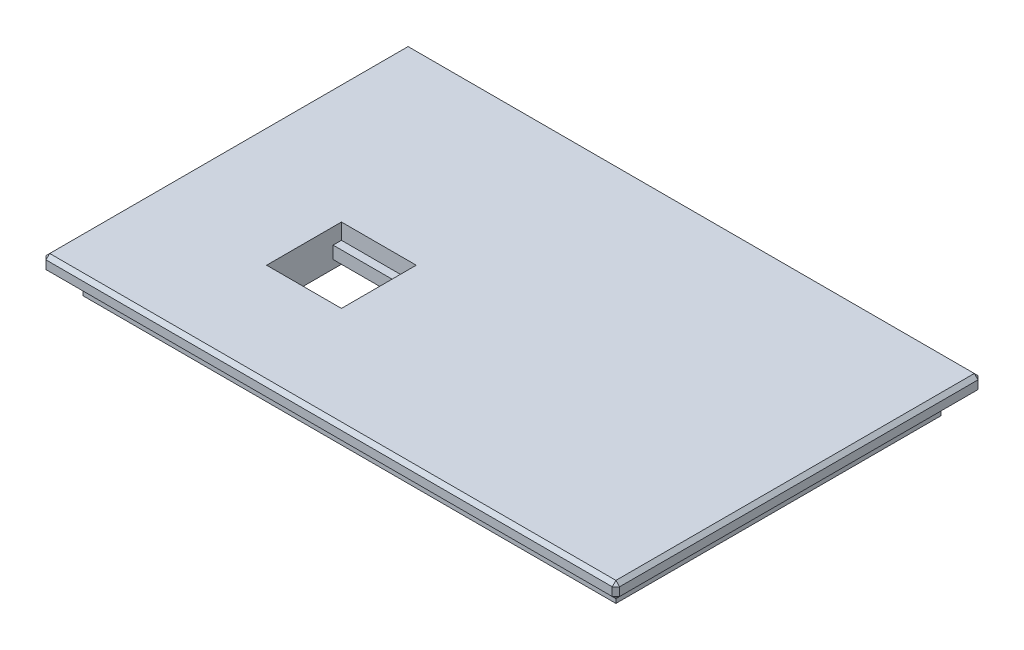
ISO-10303-21;
HEADER;
FILE_DESCRIPTION(('STEP AP214'),'2;1');
FILE_NAME('part.step','',(''),(''),'','','');
FILE_SCHEMA(('AUTOMOTIVE_DESIGN { 1 0 10303 214 1 1 1 1 }'));
ENDSEC;
DATA;
#1=APPLICATION_CONTEXT('core data for automotive mechanical design processes');
#2=APPLICATION_PROTOCOL_DEFINITION('international standard','automotive_design',2000,#1);
#3=PRODUCT_CONTEXT('',#1,'mechanical');
#4=PRODUCT('Part','Part','',(#3));
#5=PRODUCT_RELATED_PRODUCT_CATEGORY('part','',(#4));
#6=PRODUCT_DEFINITION_FORMATION('','',#4);
#7=PRODUCT_DEFINITION_CONTEXT('part definition',#1,'design');
#8=PRODUCT_DEFINITION('design','',#6,#7);
#9=PRODUCT_DEFINITION_SHAPE('','',#8);
#10=(LENGTH_UNIT() NAMED_UNIT(*) SI_UNIT(.MILLI.,.METRE.));
#11=(NAMED_UNIT(*) PLANE_ANGLE_UNIT() SI_UNIT($,.RADIAN.));
#12=(NAMED_UNIT(*) SI_UNIT($,.STERADIAN.) SOLID_ANGLE_UNIT());
#13=UNCERTAINTY_MEASURE_WITH_UNIT(LENGTH_MEASURE(1.E-05),#10,'distance_accuracy_value','');
#14=(GEOMETRIC_REPRESENTATION_CONTEXT(3) GLOBAL_UNCERTAINTY_ASSIGNED_CONTEXT((#13)) GLOBAL_UNIT_ASSIGNED_CONTEXT((#10,
#11,#12)) REPRESENTATION_CONTEXT('',''));
#15=CARTESIAN_POINT('',(0.,0.,0.));
#16=DIRECTION('',(0.,0.,1.));
#17=DIRECTION('',(1.,0.,0.));
#18=AXIS2_PLACEMENT_3D('',#15,#16,#17);
#19=CARTESIAN_POINT('',(-7.40084564826346,-10.,35.2723443337484));
#20=DIRECTION('',(0.,0.,-1.));
#21=DIRECTION('',(-1.,0.,0.));
#22=AXIS2_PLACEMENT_3D('',#19,#20,#21);
#23=PLANE('',#22);
#24=DIRECTION('',(0.,1.,0.));
#25=VECTOR('',#24,1.);
#26=CARTESIAN_POINT('',(10.5991543517365,-10.,35.2723443337484));
#27=LINE('',#26,#25);
#28=CARTESIAN_POINT('',(10.5991543517365,-3.81,35.2723443337484));
#29=VERTEX_POINT('',#28);
#30=CARTESIAN_POINT('',(10.5991543517365,0.,35.2723443337484));
#31=VERTEX_POINT('',#30);
#32=EDGE_CURVE('E331',#29,#31,#27,.T.);
#33=ORIENTED_EDGE('',*,*,#32,.F.);
#34=DIRECTION('',(-1.,0.,0.));
#35=VECTOR('',#34,1.);
#36=CARTESIAN_POINT('',(-7.40084564826346,-3.81,35.2723443337484));
#37=LINE('',#36,#35);
#38=CARTESIAN_POINT('',(-7.40084564826346,-3.81,35.2723443337484));
#39=VERTEX_POINT('',#38);
#40=EDGE_CURVE('E239',#29,#39,#37,.T.);
#41=ORIENTED_EDGE('',*,*,#40,.T.);
#42=DIRECTION('',(0.,1.,0.));
#43=VECTOR('',#42,1.);
#44=CARTESIAN_POINT('',(-7.40084564826346,-10.,35.2723443337484));
#45=LINE('',#44,#43);
#46=CARTESIAN_POINT('',(-7.40084564826346,0.,35.2723443337484));
#47=VERTEX_POINT('',#46);
#48=EDGE_CURVE('E328',#39,#47,#45,.T.);
#49=ORIENTED_EDGE('',*,*,#48,.T.);
#50=DIRECTION('',(-1.,0.,0.));
#51=VECTOR('',#50,1.);
#52=CARTESIAN_POINT('',(-7.40084564826346,0.,35.2723443337484));
#53=LINE('',#52,#51);
#54=EDGE_CURVE('E325',#31,#47,#53,.T.);
#55=ORIENTED_EDGE('',*,*,#54,.F.);
#56=EDGE_LOOP('',(#33,#41,#49,#55));
#57=FACE_BOUND('',#56,.T.);
#58=ADVANCED_FACE('F34',(#57),#23,.T.);
#59=CARTESIAN_POINT('',(-7.40084564826346,-10.,35.2723443337484));
#60=DIRECTION('',(1.,0.,0.));
#61=DIRECTION('',(0.,0.,-1.));
#62=AXIS2_PLACEMENT_3D('',#59,#60,#61);
#63=PLANE('',#62);
#64=DIRECTION('',(0.,0.,-1.));
#65=VECTOR('',#64,1.);
#66=CARTESIAN_POINT('',(-7.40084564826346,-6.81,35.2723443337484));
#67=LINE('',#66,#65);
#68=CARTESIAN_POINT('',(-7.40084564826346,-6.81,35.2723443337484));
#69=VERTEX_POINT('',#68);
#70=CARTESIAN_POINT('',(-7.40084564826346,-6.81,33.2723443337484));
#71=VERTEX_POINT('',#70);
#72=EDGE_CURVE('E232',#69,#71,#67,.T.);
#73=ORIENTED_EDGE('',*,*,#72,.F.);
#74=CARTESIAN_POINT('',(-7.40084564826346,-8.81,35.2723443337484));
#75=VERTEX_POINT('',#74);
#76=EDGE_CURVE('E329',#75,#69,#45,.T.);
#77=ORIENTED_EDGE('',*,*,#76,.F.);
#78=DIRECTION('',(0.,0.,-1.));
#79=VECTOR('',#78,1.);
#80=CARTESIAN_POINT('',(-7.40084564826346,-8.81,0.));
#81=LINE('',#80,#79);
#82=CARTESIAN_POINT('',(-7.40084564826346,-8.81,17.2723443337484));
#83=VERTEX_POINT('',#82);
#84=EDGE_CURVE('E280',#75,#83,#81,.T.);
#85=ORIENTED_EDGE('',*,*,#84,.T.);
#86=DIRECTION('',(0.,1.,0.));
#87=VECTOR('',#86,1.);
#88=CARTESIAN_POINT('',(-7.40084564826346,-10.,17.2723443337484));
#89=LINE('',#88,#87);
#90=CARTESIAN_POINT('',(-7.40084564826346,-6.81,17.2723443337484));
#91=VERTEX_POINT('',#90);
#92=EDGE_CURVE('E340',#83,#91,#89,.T.);
#93=ORIENTED_EDGE('',*,*,#92,.T.);
#94=DIRECTION('',(0.,0.,-1.));
#95=VECTOR('',#94,1.);
#96=CARTESIAN_POINT('',(-7.40084564826346,-6.81,17.2723443337484));
#97=LINE('',#96,#95);
#98=CARTESIAN_POINT('',(-7.40084564826346,-6.81,19.2723443337484));
#99=VERTEX_POINT('',#98);
#100=EDGE_CURVE('E59',#99,#91,#97,.T.);
#101=ORIENTED_EDGE('',*,*,#100,.F.);
#102=DIRECTION('',(0.,1.,0.));
#103=VECTOR('',#102,1.);
#104=CARTESIAN_POINT('',(-7.40084564826346,-6.81,19.2723443337484));
#105=LINE('',#104,#103);
#106=CARTESIAN_POINT('',(-7.40084564826346,-3.81,19.2723443337485));
#107=VERTEX_POINT('',#106);
#108=EDGE_CURVE('E259',#99,#107,#105,.T.);
#109=ORIENTED_EDGE('',*,*,#108,.T.);
#110=DIRECTION('',(0.,0.,-1.));
#111=VECTOR('',#110,1.);
#112=CARTESIAN_POINT('',(-7.40084564826346,-3.81,17.2723443337484));
#113=LINE('',#112,#111);
#114=CARTESIAN_POINT('',(-7.40084564826346,-3.81,17.2723443337484));
#115=VERTEX_POINT('',#114);
#116=EDGE_CURVE('E243',#107,#115,#113,.T.);
#117=ORIENTED_EDGE('',*,*,#116,.T.);
#118=CARTESIAN_POINT('',(-7.40084564826346,0.,17.2723443337484));
#119=VERTEX_POINT('',#118);
#120=EDGE_CURVE('E339',#115,#119,#89,.T.);
#121=ORIENTED_EDGE('',*,*,#120,.T.);
#122=DIRECTION('',(0.,0.,-1.));
#123=VECTOR('',#122,1.);
#124=CARTESIAN_POINT('',(-7.40084564826346,0.,35.2723443337484));
#125=LINE('',#124,#123);
#126=EDGE_CURVE('E311',#47,#119,#125,.T.);
#127=ORIENTED_EDGE('',*,*,#126,.F.);
#128=ORIENTED_EDGE('',*,*,#48,.F.);
#129=DIRECTION('',(0.,0.,-1.));
#130=VECTOR('',#129,1.);
#131=CARTESIAN_POINT('',(-7.40084564826346,-3.81,35.2723443337484));
#132=LINE('',#131,#130);
#133=CARTESIAN_POINT('',(-7.40084564826346,-3.81,33.2723443337484));
#134=VERTEX_POINT('',#133);
#135=EDGE_CURVE('E51',#39,#134,#132,.T.);
#136=ORIENTED_EDGE('',*,*,#135,.T.);
#137=DIRECTION('',(0.,1.,0.));
#138=VECTOR('',#137,1.);
#139=CARTESIAN_POINT('',(-7.40084564826346,-6.81,33.2723443337484));
#140=LINE('',#139,#138);
#141=EDGE_CURVE('E226',#71,#134,#140,.T.);
#142=ORIENTED_EDGE('',*,*,#141,.F.);
#143=EDGE_LOOP('',(#73,#77,#85,#93,#101,#109,#117,#121,#127,#128,#136,#142));
#144=FACE_BOUND('',#143,.T.);
#145=ADVANCED_FACE('F241',(#144),#63,.T.);
#146=CARTESIAN_POINT('',(-7.40084564826346,-10.,17.2723443337484));
#147=DIRECTION('',(0.,0.,1.));
#148=DIRECTION('',(1.,0.,0.));
#149=AXIS2_PLACEMENT_3D('',#146,#147,#148);
#150=PLANE('',#149);
#151=DIRECTION('',(0.,1.,0.));
#152=VECTOR('',#151,1.);
#153=CARTESIAN_POINT('',(10.5991543517365,-10.,17.2723443337484));
#154=LINE('',#153,#152);
#155=CARTESIAN_POINT('',(10.5991543517365,-8.81,17.2723443337484));
#156=VERTEX_POINT('',#155);
#157=CARTESIAN_POINT('',(10.5991543517365,-6.81,17.2723443337484));
#158=VERTEX_POINT('',#157);
#159=EDGE_CURVE('E336',#156,#158,#154,.T.);
#160=ORIENTED_EDGE('',*,*,#159,.T.);
#161=DIRECTION('',(1.,0.,0.));
#162=VECTOR('',#161,1.);
#163=CARTESIAN_POINT('',(-7.40084564826346,-6.81,17.2723443337484));
#164=LINE('',#163,#162);
#165=EDGE_CURVE('E251',#91,#158,#164,.T.);
#166=ORIENTED_EDGE('',*,*,#165,.F.);
#167=ORIENTED_EDGE('',*,*,#92,.F.);
#168=DIRECTION('',(1.,0.,0.));
#169=VECTOR('',#168,1.);
#170=CARTESIAN_POINT('',(0.,-8.81,17.2723443337484));
#171=LINE('',#170,#169);
#172=EDGE_CURVE('E277',#83,#156,#171,.T.);
#173=ORIENTED_EDGE('',*,*,#172,.T.);
#174=EDGE_LOOP('',(#160,#166,#167,#173));
#175=FACE_BOUND('',#174,.T.);
#176=ADVANCED_FACE('F568',(#175),#150,.T.);
#177=CARTESIAN_POINT('',(10.5991543517365,-10.,35.2723443337484));
#178=DIRECTION('',(-1.,0.,0.));
#179=DIRECTION('',(0.,0.,1.));
#180=AXIS2_PLACEMENT_3D('',#177,#178,#179);
#181=PLANE('',#180);
#182=DIRECTION('',(0.,0.,1.));
#183=VECTOR('',#182,1.);
#184=CARTESIAN_POINT('',(10.5991543517365,-6.81,35.2723443337484));
#185=LINE('',#184,#183);
#186=CARTESIAN_POINT('',(10.5991543517365,-6.81,33.2723443337484));
#187=VERTEX_POINT('',#186);
#188=CARTESIAN_POINT('',(10.5991543517365,-6.81,35.2723443337484));
#189=VERTEX_POINT('',#188);
#190=EDGE_CURVE('E231',#187,#189,#185,.T.);
#191=ORIENTED_EDGE('',*,*,#190,.F.);
#192=DIRECTION('',(0.,1.,0.));
#193=VECTOR('',#192,1.);
#194=CARTESIAN_POINT('',(10.5991543517365,-6.81,33.2723443337484));
#195=LINE('',#194,#193);
#196=CARTESIAN_POINT('',(10.5991543517365,-3.81,33.2723443337484));
#197=VERTEX_POINT('',#196);
#198=EDGE_CURVE('E228',#187,#197,#195,.T.);
#199=ORIENTED_EDGE('',*,*,#198,.T.);
#200=DIRECTION('',(0.,0.,1.));
#201=VECTOR('',#200,1.);
#202=CARTESIAN_POINT('',(10.5991543517365,-3.81,35.2723443337484));
#203=LINE('',#202,#201);
#204=EDGE_CURVE('E614',#197,#29,#203,.T.);
#205=ORIENTED_EDGE('',*,*,#204,.T.);
#206=ORIENTED_EDGE('',*,*,#32,.T.);
#207=DIRECTION('',(0.,0.,1.));
#208=VECTOR('',#207,1.);
#209=CARTESIAN_POINT('',(10.5991543517365,0.,35.2723443337484));
#210=LINE('',#209,#208);
#211=CARTESIAN_POINT('',(10.5991543517365,0.,17.2723443337484));
#212=VERTEX_POINT('',#211);
#213=EDGE_CURVE('E322',#212,#31,#210,.T.);
#214=ORIENTED_EDGE('',*,*,#213,.F.);
#215=CARTESIAN_POINT('',(10.5991543517365,-3.81,17.2723443337484));
#216=VERTEX_POINT('',#215);
#217=EDGE_CURVE('E335',#216,#212,#154,.T.);
#218=ORIENTED_EDGE('',*,*,#217,.F.);
#219=DIRECTION('',(0.,0.,1.));
#220=VECTOR('',#219,1.);
#221=CARTESIAN_POINT('',(10.5991543517365,-3.81,17.2723443337484));
#222=LINE('',#221,#220);
#223=CARTESIAN_POINT('',(10.5991543517365,-3.81,19.2723443337485));
#224=VERTEX_POINT('',#223);
#225=EDGE_CURVE('E263',#216,#224,#222,.T.);
#226=ORIENTED_EDGE('',*,*,#225,.T.);
#227=DIRECTION('',(0.,1.,0.));
#228=VECTOR('',#227,1.);
#229=CARTESIAN_POINT('',(10.5991543517365,-6.81,19.2723443337485));
#230=LINE('',#229,#228);
#231=CARTESIAN_POINT('',(10.5991543517365,-6.81,19.2723443337485));
#232=VERTEX_POINT('',#231);
#233=EDGE_CURVE('E268',#232,#224,#230,.T.);
#234=ORIENTED_EDGE('',*,*,#233,.F.);
#235=DIRECTION('',(0.,0.,1.));
#236=VECTOR('',#235,1.);
#237=CARTESIAN_POINT('',(10.5991543517365,-6.81,17.2723443337484));
#238=LINE('',#237,#236);
#239=EDGE_CURVE('E255',#158,#232,#238,.T.);
#240=ORIENTED_EDGE('',*,*,#239,.F.);
#241=ORIENTED_EDGE('',*,*,#159,.F.);
#242=DIRECTION('',(0.,0.,1.));
#243=VECTOR('',#242,1.);
#244=CARTESIAN_POINT('',(10.5991543517365,-8.81,0.));
#245=LINE('',#244,#243);
#246=CARTESIAN_POINT('',(10.5991543517365,-8.81,35.2723443337484));
#247=VERTEX_POINT('',#246);
#248=EDGE_CURVE('E274',#156,#247,#245,.T.);
#249=ORIENTED_EDGE('',*,*,#248,.T.);
#250=EDGE_CURVE('E332',#247,#189,#27,.T.);
#251=ORIENTED_EDGE('',*,*,#250,.T.);
#252=EDGE_LOOP('',(#191,#199,#205,#206,#214,#218,#226,#234,#240,#241,#249,#251));
#253=FACE_BOUND('',#252,.T.);
#254=ADVANCED_FACE('F588',(#253),#181,.T.);
#255=CARTESIAN_POINT('',(101.17,-3.81,-28.194));
#256=DIRECTION('',(0.,-1.,0.));
#257=DIRECTION('',(0.,0.,-1.));
#258=AXIS2_PLACEMENT_3D('',#255,#256,#257);
#259=PLANE('',#258);
#260=DIRECTION('',(0.,0.,-1.));
#261=VECTOR('',#260,1.);
#262=CARTESIAN_POINT('',(-35.941,-3.81,-28.194));
#263=LINE('',#262,#261);
#264=CARTESIAN_POINT('',(-35.941,-3.81,58.917));
#265=VERTEX_POINT('',#264);
#266=CARTESIAN_POINT('',(-35.941,-3.81,-27.305));
#267=VERTEX_POINT('',#266);
#268=EDGE_CURVE('E356',#265,#267,#263,.T.);
#269=ORIENTED_EDGE('',*,*,#268,.T.);
#270=DIRECTION('',(1.,0.,0.));
#271=VECTOR('',#270,1.);
#272=CARTESIAN_POINT('',(101.17,-3.81,-27.305));
#273=LINE('',#272,#271);
#274=CARTESIAN_POINT('',(100.281,-3.81,-27.305));
#275=VERTEX_POINT('',#274);
#276=EDGE_CURVE('E358',#267,#275,#273,.T.);
#277=ORIENTED_EDGE('',*,*,#276,.T.);
#278=DIRECTION('',(0.,0.,1.));
#279=VECTOR('',#278,1.);
#280=CARTESIAN_POINT('',(100.281,-3.81,-28.194));
#281=LINE('',#280,#279);
#282=CARTESIAN_POINT('',(100.281,-3.81,58.917));
#283=VERTEX_POINT('',#282);
#284=EDGE_CURVE('E354',#275,#283,#281,.T.);
#285=ORIENTED_EDGE('',*,*,#284,.T.);
#286=DIRECTION('',(-1.,0.,0.));
#287=VECTOR('',#286,1.);
#288=CARTESIAN_POINT('',(101.17,-3.81,58.917));
#289=LINE('',#288,#287);
#290=EDGE_CURVE('E352',#283,#265,#289,.T.);
#291=ORIENTED_EDGE('',*,*,#290,.T.);
#292=EDGE_LOOP('',(#269,#277,#285,#291));
#293=FACE_BOUND('',#292,.T.);
#294=DIRECTION('',(-1.,0.,0.));
#295=VECTOR('',#294,1.);
#296=CARTESIAN_POINT('',(-31.941,-3.81,-23.305));
#297=LINE('',#296,#295);
#298=CARTESIAN_POINT('',(96.281,-3.81,-23.305));
#299=VERTEX_POINT('',#298);
#300=CARTESIAN_POINT('',(-31.941,-3.81,-23.305));
#301=VERTEX_POINT('',#300);
#302=EDGE_CURVE('E288',#299,#301,#297,.T.);
#303=ORIENTED_EDGE('',*,*,#302,.T.);
#304=DIRECTION('',(0.,0.,1.));
#305=VECTOR('',#304,1.);
#306=CARTESIAN_POINT('',(-31.941,-3.81,-23.305));
#307=LINE('',#306,#305);
#308=CARTESIAN_POINT('',(-31.941,-3.81,54.917));
#309=VERTEX_POINT('',#308);
#310=EDGE_CURVE('E283',#301,#309,#307,.T.);
#311=ORIENTED_EDGE('',*,*,#310,.T.);
#312=DIRECTION('',(1.,0.,0.));
#313=VECTOR('',#312,1.);
#314=CARTESIAN_POINT('',(-31.941,-3.81,54.917));
#315=LINE('',#314,#313);
#316=CARTESIAN_POINT('',(96.281,-3.81,54.917));
#317=VERTEX_POINT('',#316);
#318=EDGE_CURVE('E300',#309,#317,#315,.T.);
#319=ORIENTED_EDGE('',*,*,#318,.T.);
#320=DIRECTION('',(0.,0.,-1.));
#321=VECTOR('',#320,1.);
#322=CARTESIAN_POINT('',(96.281,-3.81,-23.305));
#323=LINE('',#322,#321);
#324=EDGE_CURVE('E303',#317,#299,#323,.T.);
#325=ORIENTED_EDGE('',*,*,#324,.T.);
#326=EDGE_LOOP('',(#303,#311,#319,#325));
#327=FACE_BOUND('',#326,.T.);
#328=ADVANCED_FACE('F537',(#293,#327),#259,.T.);
#329=CARTESIAN_POINT('',(101.17,0.,-28.194));
#330=DIRECTION('',(0.,-1.,0.));
#331=DIRECTION('',(0.,0.,-1.));
#332=AXIS2_PLACEMENT_3D('',#329,#330,#331);
#333=PLANE('',#332);
#334=DIRECTION('',(-1.,0.,0.));
#335=VECTOR('',#334,1.);
#336=CARTESIAN_POINT('',(-36.83,0.,-27.305));
#337=LINE('',#336,#335);
#338=CARTESIAN_POINT('',(100.281,0.,-27.305));
#339=VERTEX_POINT('',#338);
#340=CARTESIAN_POINT('',(-35.941,0.,-27.305));
#341=VERTEX_POINT('',#340);
#342=EDGE_CURVE('E383',#339,#341,#337,.T.);
#343=ORIENTED_EDGE('',*,*,#342,.T.);
#344=DIRECTION('',(0.,0.,1.));
#345=VECTOR('',#344,1.);
#346=CARTESIAN_POINT('',(-35.941,0.,59.806));
#347=LINE('',#346,#345);
#348=CARTESIAN_POINT('',(-35.941,0.,58.917));
#349=VERTEX_POINT('',#348);
#350=EDGE_CURVE('E385',#341,#349,#347,.T.);
#351=ORIENTED_EDGE('',*,*,#350,.T.);
#352=DIRECTION('',(1.,0.,0.));
#353=VECTOR('',#352,1.);
#354=CARTESIAN_POINT('',(101.17,0.,58.917));
#355=LINE('',#354,#353);
#356=CARTESIAN_POINT('',(100.281,0.,58.917));
#357=VERTEX_POINT('',#356);
#358=EDGE_CURVE('E379',#349,#357,#355,.T.);
#359=ORIENTED_EDGE('',*,*,#358,.T.);
#360=DIRECTION('',(0.,0.,-1.));
#361=VECTOR('',#360,1.);
#362=CARTESIAN_POINT('',(100.281,0.,-28.194));
#363=LINE('',#362,#361);
#364=EDGE_CURVE('E381',#357,#339,#363,.T.);
#365=ORIENTED_EDGE('',*,*,#364,.T.);
#366=EDGE_LOOP('',(#343,#351,#359,#365));
#367=FACE_BOUND('',#366,.T.);
#368=ORIENTED_EDGE('',*,*,#126,.T.);
#369=DIRECTION('',(1.,0.,0.));
#370=VECTOR('',#369,1.);
#371=CARTESIAN_POINT('',(-7.40084564826346,0.,17.2723443337484));
#372=LINE('',#371,#370);
#373=EDGE_CURVE('E319',#119,#212,#372,.T.);
#374=ORIENTED_EDGE('',*,*,#373,.T.);
#375=ORIENTED_EDGE('',*,*,#213,.T.);
#376=ORIENTED_EDGE('',*,*,#54,.T.);
#377=EDGE_LOOP('',(#368,#374,#375,#376));
#378=FACE_BOUND('',#377,.T.);
#379=ADVANCED_FACE('F507',(#367,#378),#333,.F.);
#380=CARTESIAN_POINT('',(101.17,-3.81,59.806));
#381=DIRECTION('',(1.,0.,0.));
#382=DIRECTION('',(0.,0.,-1.));
#383=AXIS2_PLACEMENT_3D('',#380,#381,#382);
#384=PLANE('',#383);
#385=DIRECTION('',(0.,0.,-1.));
#386=VECTOR('',#385,1.);
#387=CARTESIAN_POINT('',(101.17,-2.921,59.806));
#388=LINE('',#387,#386);
#389=CARTESIAN_POINT('',(101.17,-2.921,58.917));
#390=VERTEX_POINT('',#389);
#391=CARTESIAN_POINT('',(101.17,-2.921,-27.305));
#392=VERTEX_POINT('',#391);
#393=EDGE_CURVE('E374',#390,#392,#388,.T.);
#394=ORIENTED_EDGE('',*,*,#393,.T.);
#395=DIRECTION('',(0.,1.,0.));
#396=VECTOR('',#395,1.);
#397=CARTESIAN_POINT('',(101.17,-3.81,-27.305));
#398=LINE('',#397,#396);
#399=CARTESIAN_POINT('',(101.17,-0.889000000000001,-27.305));
#400=VERTEX_POINT('',#399);
#401=EDGE_CURVE('E376',#392,#400,#398,.T.);
#402=ORIENTED_EDGE('',*,*,#401,.T.);
#403=DIRECTION('',(0.,0.,1.));
#404=VECTOR('',#403,1.);
#405=CARTESIAN_POINT('',(101.17,-0.889000000000001,59.806));
#406=LINE('',#405,#404);
#407=CARTESIAN_POINT('',(101.17,-0.889000000000001,58.917));
#408=VERTEX_POINT('',#407);
#409=EDGE_CURVE('E372',#400,#408,#406,.T.);
#410=ORIENTED_EDGE('',*,*,#409,.T.);
#411=DIRECTION('',(0.,-1.,0.));
#412=VECTOR('',#411,1.);
#413=CARTESIAN_POINT('',(101.17,-3.81,58.917));
#414=LINE('',#413,#412);
#415=EDGE_CURVE('E370',#408,#390,#414,.T.);
#416=ORIENTED_EDGE('',*,*,#415,.T.);
#417=EDGE_LOOP('',(#394,#402,#410,#416));
#418=FACE_BOUND('',#417,.T.);
#419=ADVANCED_FACE('F491',(#418),#384,.T.);
#420=CARTESIAN_POINT('',(-36.83,-3.81,59.806));
#421=DIRECTION('',(0.,0.,1.));
#422=DIRECTION('',(1.,0.,0.));
#423=AXIS2_PLACEMENT_3D('',#420,#421,#422);
#424=PLANE('',#423);
#425=DIRECTION('',(1.,0.,0.));
#426=VECTOR('',#425,1.);
#427=CARTESIAN_POINT('',(-36.83,-2.921,59.806));
#428=LINE('',#427,#426);
#429=CARTESIAN_POINT('',(-35.941,-2.921,59.806));
#430=VERTEX_POINT('',#429);
#431=CARTESIAN_POINT('',(100.281,-2.921,59.806));
#432=VERTEX_POINT('',#431);
#433=EDGE_CURVE('E43',#430,#432,#428,.T.);
#434=ORIENTED_EDGE('',*,*,#433,.T.);
#435=DIRECTION('',(0.,1.,0.));
#436=VECTOR('',#435,1.);
#437=CARTESIAN_POINT('',(100.281,-3.81,59.806));
#438=LINE('',#437,#436);
#439=CARTESIAN_POINT('',(100.281,-0.889000000000001,59.806));
#440=VERTEX_POINT('',#439);
#441=EDGE_CURVE('E11',#432,#440,#438,.T.);
#442=ORIENTED_EDGE('',*,*,#441,.T.);
#443=DIRECTION('',(-1.,0.,0.));
#444=VECTOR('',#443,1.);
#445=CARTESIAN_POINT('',(-36.83,-0.889000000000001,59.806));
#446=LINE('',#445,#444);
#447=CARTESIAN_POINT('',(-35.941,-0.889000000000001,59.806));
#448=VERTEX_POINT('',#447);
#449=EDGE_CURVE('E388',#440,#448,#446,.T.);
#450=ORIENTED_EDGE('',*,*,#449,.T.);
#451=DIRECTION('',(0.,-1.,0.));
#452=VECTOR('',#451,1.);
#453=CARTESIAN_POINT('',(-35.941,-3.81,59.806));
#454=LINE('',#453,#452);
#455=EDGE_CURVE('E390',#448,#430,#454,.T.);
#456=ORIENTED_EDGE('',*,*,#455,.T.);
#457=EDGE_LOOP('',(#434,#442,#450,#456));
#458=FACE_BOUND('',#457,.T.);
#459=ADVANCED_FACE('F470',(#458),#424,.T.);
#460=CARTESIAN_POINT('',(-36.83,-3.81,59.806));
#461=DIRECTION('',(-1.,0.,0.));
#462=DIRECTION('',(0.,0.,1.));
#463=AXIS2_PLACEMENT_3D('',#460,#461,#462);
#464=PLANE('',#463);
#465=DIRECTION('',(0.,-1.,0.));
#466=VECTOR('',#465,1.);
#467=CARTESIAN_POINT('',(-36.83,-3.81,-27.305));
#468=LINE('',#467,#466);
#469=CARTESIAN_POINT('',(-36.83,-0.889000000000001,-27.305));
#470=VERTEX_POINT('',#469);
#471=CARTESIAN_POINT('',(-36.83,-2.921,-27.305));
#472=VERTEX_POINT('',#471);
#473=EDGE_CURVE('E365',#470,#472,#468,.T.);
#474=ORIENTED_EDGE('',*,*,#473,.T.);
#475=DIRECTION('',(0.,0.,1.));
#476=VECTOR('',#475,1.);
#477=CARTESIAN_POINT('',(-36.83,-2.921,59.806));
#478=LINE('',#477,#476);
#479=CARTESIAN_POINT('',(-36.83,-2.921,58.917));
#480=VERTEX_POINT('',#479);
#481=EDGE_CURVE('E367',#472,#480,#478,.T.);
#482=ORIENTED_EDGE('',*,*,#481,.T.);
#483=DIRECTION('',(0.,1.,0.));
#484=VECTOR('',#483,1.);
#485=CARTESIAN_POINT('',(-36.83,-3.81,58.917));
#486=LINE('',#485,#484);
#487=CARTESIAN_POINT('',(-36.83,-0.889000000000001,58.917));
#488=VERTEX_POINT('',#487);
#489=EDGE_CURVE('E361',#480,#488,#486,.T.);
#490=ORIENTED_EDGE('',*,*,#489,.T.);
#491=DIRECTION('',(0.,0.,-1.));
#492=VECTOR('',#491,1.);
#493=CARTESIAN_POINT('',(-36.83,-0.889000000000001,-28.194));
#494=LINE('',#493,#492);
#495=EDGE_CURVE('E363',#488,#470,#494,.T.);
#496=ORIENTED_EDGE('',*,*,#495,.T.);
#497=EDGE_LOOP('',(#474,#482,#490,#496));
#498=FACE_BOUND('',#497,.T.);
#499=ADVANCED_FACE('F552',(#498),#464,.T.);
#500=CARTESIAN_POINT('',(-36.83,-3.81,-28.194));
#501=DIRECTION('',(0.,0.,-1.));
#502=DIRECTION('',(-1.,0.,0.));
#503=AXIS2_PLACEMENT_3D('',#500,#501,#502);
#504=PLANE('',#503);
#505=DIRECTION('',(0.,-1.,0.));
#506=VECTOR('',#505,1.);
#507=CARTESIAN_POINT('',(100.281,-3.81,-28.194));
#508=LINE('',#507,#506);
#509=CARTESIAN_POINT('',(100.281,-0.889000000000001,-28.194));
#510=VERTEX_POINT('',#509);
#511=CARTESIAN_POINT('',(100.281,-2.921,-28.194));
#512=VERTEX_POINT('',#511);
#513=EDGE_CURVE('E345',#510,#512,#508,.T.);
#514=ORIENTED_EDGE('',*,*,#513,.T.);
#515=DIRECTION('',(-1.,0.,0.));
#516=VECTOR('',#515,1.);
#517=CARTESIAN_POINT('',(-36.83,-2.921,-28.194));
#518=LINE('',#517,#516);
#519=CARTESIAN_POINT('',(-35.941,-2.921,-28.194));
#520=VERTEX_POINT('',#519);
#521=EDGE_CURVE('E349',#512,#520,#518,.T.);
#522=ORIENTED_EDGE('',*,*,#521,.T.);
#523=DIRECTION('',(0.,1.,0.));
#524=VECTOR('',#523,1.);
#525=CARTESIAN_POINT('',(-35.941,-3.81,-28.194));
#526=LINE('',#525,#524);
#527=CARTESIAN_POINT('',(-35.941,-0.889000000000001,-28.194));
#528=VERTEX_POINT('',#527);
#529=EDGE_CURVE('E347',#520,#528,#526,.T.);
#530=ORIENTED_EDGE('',*,*,#529,.T.);
#531=DIRECTION('',(1.,0.,0.));
#532=VECTOR('',#531,1.);
#533=CARTESIAN_POINT('',(101.17,-0.889000000000001,-28.194));
#534=LINE('',#533,#532);
#535=EDGE_CURVE('E343',#528,#510,#534,.T.);
#536=ORIENTED_EDGE('',*,*,#535,.T.);
#537=EDGE_LOOP('',(#514,#522,#530,#536));
#538=FACE_BOUND('',#537,.T.);
#539=ADVANCED_FACE('F550',(#538),#504,.T.);
#540=CARTESIAN_POINT('',(101.17,0.,58.917));
#541=DIRECTION('',(0.,0.707106781186547,0.707106781186547));
#542=DIRECTION('',(0.,-0.707106781186548,0.707106781186548));
#543=AXIS2_PLACEMENT_3D('',#540,#541,#542);
#544=PLANE('',#543);
#545=DIRECTION('',(0.,-0.707106781186547,0.707106781186547));
#546=VECTOR('',#545,1.);
#547=CARTESIAN_POINT('',(100.281,-0.444499999999987,59.3615));
#548=LINE('',#547,#546);
#549=EDGE_CURVE('E38',#357,#440,#548,.T.);
#550=ORIENTED_EDGE('',*,*,#549,.F.);
#551=ORIENTED_EDGE('',*,*,#358,.F.);
#552=DIRECTION('',(0.,0.707106781186547,-0.707106781186547));
#553=VECTOR('',#552,1.);
#554=CARTESIAN_POINT('',(-35.941,0.,58.917));
#555=LINE('',#554,#553);
#556=EDGE_CURVE('E451',#448,#349,#555,.T.);
#557=ORIENTED_EDGE('',*,*,#556,.F.);
#558=ORIENTED_EDGE('',*,*,#449,.F.);
#559=EDGE_LOOP('',(#550,#551,#557,#558));
#560=FACE_BOUND('',#559,.T.);
#561=ADVANCED_FACE('F36',(#560),#544,.T.);
#562=CARTESIAN_POINT('',(101.17,-0.889000000000001,58.917));
#563=DIRECTION('',(0.57735026918962,0.57735026918962,0.577350269189638));
#564=DIRECTION('',(0.707106781186559,0.,-0.707106781186536));
#565=AXIS2_PLACEMENT_3D('',#562,#563,#564);
#566=PLANE('',#565);
#567=DIRECTION('',(-0.707106781186547,0.707106781186547,0.));
#568=VECTOR('',#567,1.);
#569=CARTESIAN_POINT('',(101.17,-0.889000000000001,58.917));
#570=LINE('',#569,#568);
#571=EDGE_CURVE('E447',#357,#408,#570,.F.);
#572=ORIENTED_EDGE('',*,*,#571,.F.);
#573=ORIENTED_EDGE('',*,*,#549,.T.);
#574=DIRECTION('',(-0.707106781186559,0.,0.707106781186536));
#575=VECTOR('',#574,1.);
#576=CARTESIAN_POINT('',(101.17,-0.889000000000001,58.917));
#577=LINE('',#576,#575);
#578=EDGE_CURVE('E450',#408,#440,#577,.T.);
#579=ORIENTED_EDGE('',*,*,#578,.F.);
#580=EDGE_LOOP('',(#572,#573,#579));
#581=FACE_BOUND('',#580,.T.);
#582=ADVANCED_FACE('F464',(#581),#566,.T.);
#583=CARTESIAN_POINT('',(-35.941,0.,58.917));
#584=DIRECTION('',(-0.577350269189626,0.577350269189626,0.577350269189626));
#585=DIRECTION('',(0.707106781186547,0.,0.707106781186547));
#586=AXIS2_PLACEMENT_3D('',#583,#584,#585);
#587=PLANE('',#586);
#588=DIRECTION('',(-0.707106781186547,0.,-0.707106781186547));
#589=VECTOR('',#588,1.);
#590=CARTESIAN_POINT('',(-36.3855,-0.889000000000001,59.3615));
#591=LINE('',#590,#589);
#592=EDGE_CURVE('E442',#448,#488,#591,.T.);
#593=ORIENTED_EDGE('',*,*,#592,.F.);
#594=ORIENTED_EDGE('',*,*,#556,.T.);
#595=DIRECTION('',(-0.707106781186547,-0.707106781186547,0.));
#596=VECTOR('',#595,1.);
#597=CARTESIAN_POINT('',(-35.941,0.,58.917));
#598=LINE('',#597,#596);
#599=EDGE_CURVE('E445',#488,#349,#598,.F.);
#600=ORIENTED_EDGE('',*,*,#599,.F.);
#601=EDGE_LOOP('',(#593,#594,#600));
#602=FACE_BOUND('',#601,.T.);
#603=ADVANCED_FACE('F522',(#602),#587,.T.);
#604=CARTESIAN_POINT('',(100.281,-3.81,59.806));
#605=DIRECTION('',(-0.707106781186536,0.,-0.707106781186559));
#606=DIRECTION('',(-0.707106781186559,0.,0.707106781186536));
#607=AXIS2_PLACEMENT_3D('',#604,#605,#606);
#608=PLANE('',#607);
#609=ORIENTED_EDGE('',*,*,#578,.T.);
#610=ORIENTED_EDGE('',*,*,#441,.F.);
#611=DIRECTION('',(0.707106781186559,0.,-0.707106781186536));
#612=VECTOR('',#611,1.);
#613=CARTESIAN_POINT('',(100.7255,-2.921,59.3615));
#614=LINE('',#613,#612);
#615=EDGE_CURVE('E436',#390,#432,#614,.F.);
#616=ORIENTED_EDGE('',*,*,#615,.F.);
#617=ORIENTED_EDGE('',*,*,#415,.F.);
#618=EDGE_LOOP('',(#609,#610,#616,#617));
#619=FACE_BOUND('',#618,.T.);
#620=ADVANCED_FACE('F475',(#619),#608,.F.);
#621=CARTESIAN_POINT('',(100.281,0.,-28.194));
#622=DIRECTION('',(0.707106781186547,0.707106781186547,0.));
#623=DIRECTION('',(-0.707106781186548,0.707106781186548,0.));
#624=AXIS2_PLACEMENT_3D('',#621,#622,#623);
#625=PLANE('',#624);
#626=ORIENTED_EDGE('',*,*,#571,.T.);
#627=ORIENTED_EDGE('',*,*,#409,.F.);
#628=DIRECTION('',(0.707106781186548,-0.707106781186548,0.));
#629=VECTOR('',#628,1.);
#630=CARTESIAN_POINT('',(101.17,-0.889000000000001,-27.305));
#631=LINE('',#630,#629);
#632=EDGE_CURVE('E433',#339,#400,#631,.T.);
#633=ORIENTED_EDGE('',*,*,#632,.F.);
#634=ORIENTED_EDGE('',*,*,#364,.F.);
#635=EDGE_LOOP('',(#626,#627,#633,#634));
#636=FACE_BOUND('',#635,.T.);
#637=ADVANCED_FACE('F504',(#636),#625,.T.);
#638=CARTESIAN_POINT('',(101.17,0.,-27.305));
#639=DIRECTION('',(0.,0.707106781186547,-0.707106781186547));
#640=DIRECTION('',(0.,0.707106781186548,0.707106781186548));
#641=AXIS2_PLACEMENT_3D('',#638,#639,#640);
#642=PLANE('',#641);
#643=DIRECTION('',(0.,-0.707106781186548,-0.707106781186548));
#644=VECTOR('',#643,1.);
#645=CARTESIAN_POINT('',(-35.941,-0.889000000000001,-28.194));
#646=LINE('',#645,#644);
#647=EDGE_CURVE('E427',#341,#528,#646,.T.);
#648=ORIENTED_EDGE('',*,*,#647,.F.);
#649=ORIENTED_EDGE('',*,*,#342,.F.);
#650=DIRECTION('',(0.,0.707106781186548,0.707106781186548));
#651=VECTOR('',#650,1.);
#652=CARTESIAN_POINT('',(100.281,-0.444499999999981,-27.7495));
#653=LINE('',#652,#651);
#654=EDGE_CURVE('E430',#510,#339,#653,.T.);
#655=ORIENTED_EDGE('',*,*,#654,.F.);
#656=ORIENTED_EDGE('',*,*,#535,.F.);
#657=EDGE_LOOP('',(#648,#649,#655,#656));
#658=FACE_BOUND('',#657,.T.);
#659=ADVANCED_FACE('F512',(#658),#642,.T.);
#660=CARTESIAN_POINT('',(-35.941,0.,-28.194));
#661=DIRECTION('',(-0.707106781186547,0.707106781186547,0.));
#662=DIRECTION('',(-0.707106781186548,-0.707106781186548,0.));
#663=AXIS2_PLACEMENT_3D('',#660,#661,#662);
#664=PLANE('',#663);
#665=ORIENTED_EDGE('',*,*,#599,.T.);
#666=ORIENTED_EDGE('',*,*,#350,.F.);
#667=DIRECTION('',(0.707106781186547,0.707106781186547,0.));
#668=VECTOR('',#667,1.);
#669=CARTESIAN_POINT('',(-36.3855,-0.444499999999995,-27.305));
#670=LINE('',#669,#668);
#671=EDGE_CURVE('E424',#470,#341,#670,.T.);
#672=ORIENTED_EDGE('',*,*,#671,.F.);
#673=ORIENTED_EDGE('',*,*,#495,.F.);
#674=EDGE_LOOP('',(#665,#666,#672,#673));
#675=FACE_BOUND('',#674,.T.);
#676=ADVANCED_FACE('F521',(#675),#664,.T.);
#677=CARTESIAN_POINT('',(-36.83,-3.81,58.917));
#678=DIRECTION('',(0.707106781186547,0.,-0.707106781186547));
#679=DIRECTION('',(-0.707106781186548,0.,-0.707106781186548));
#680=AXIS2_PLACEMENT_3D('',#677,#678,#679);
#681=PLANE('',#680);
#682=ORIENTED_EDGE('',*,*,#592,.T.);
#683=ORIENTED_EDGE('',*,*,#489,.F.);
#684=DIRECTION('',(0.707106781186547,0.,0.707106781186547));
#685=VECTOR('',#684,1.);
#686=CARTESIAN_POINT('',(-36.83,-2.921,58.917));
#687=LINE('',#686,#685);
#688=EDGE_CURVE('E421',#430,#480,#687,.F.);
#689=ORIENTED_EDGE('',*,*,#688,.F.);
#690=ORIENTED_EDGE('',*,*,#455,.F.);
#691=EDGE_LOOP('',(#682,#683,#689,#690));
#692=FACE_BOUND('',#691,.T.);
#693=ADVANCED_FACE('F526',(#692),#681,.F.);
#694=CARTESIAN_POINT('',(-36.83,-2.921,59.806));
#695=DIRECTION('',(0.,0.707106781186547,-0.707106781186547));
#696=DIRECTION('',(0.,0.707106781186548,0.707106781186548));
#697=AXIS2_PLACEMENT_3D('',#694,#695,#696);
#698=PLANE('',#697);
#699=DIRECTION('',(0.,0.707106781186547,0.707106781186547));
#700=VECTOR('',#699,1.);
#701=CARTESIAN_POINT('',(100.281,-3.81,58.917));
#702=LINE('',#701,#700);
#703=EDGE_CURVE('E439',#432,#283,#702,.F.);
#704=ORIENTED_EDGE('',*,*,#703,.F.);
#705=ORIENTED_EDGE('',*,*,#433,.F.);
#706=DIRECTION('',(0.,-0.707106781186547,-0.707106781186547));
#707=VECTOR('',#706,1.);
#708=CARTESIAN_POINT('',(-35.941,-3.3655,59.3615));
#709=LINE('',#708,#707);
#710=EDGE_CURVE('E418',#265,#430,#709,.F.);
#711=ORIENTED_EDGE('',*,*,#710,.F.);
#712=ORIENTED_EDGE('',*,*,#290,.F.);
#713=EDGE_LOOP('',(#704,#705,#711,#712));
#714=FACE_BOUND('',#713,.T.);
#715=ADVANCED_FACE('F479',(#714),#698,.F.);
#716=CARTESIAN_POINT('',(100.281,-3.81,58.917));
#717=DIRECTION('',(0.57735026918962,-0.57735026918962,0.577350269189638));
#718=DIRECTION('',(0.707106781186559,0.,-0.707106781186536));
#719=AXIS2_PLACEMENT_3D('',#716,#717,#718);
#720=PLANE('',#719);
#721=ORIENTED_EDGE('',*,*,#615,.T.);
#722=ORIENTED_EDGE('',*,*,#703,.T.);
#723=DIRECTION('',(-0.707106781186547,-0.707106781186547,0.));
#724=VECTOR('',#723,1.);
#725=CARTESIAN_POINT('',(100.281,-3.81,58.917));
#726=LINE('',#725,#724);
#727=EDGE_CURVE('E415',#390,#283,#726,.T.);
#728=ORIENTED_EDGE('',*,*,#727,.F.);
#729=EDGE_LOOP('',(#721,#722,#728));
#730=FACE_BOUND('',#729,.T.);
#731=ADVANCED_FACE('F483',(#730),#720,.T.);
#732=CARTESIAN_POINT('',(101.17,-0.889000000000001,-27.305));
#733=DIRECTION('',(0.577350269189624,0.577350269189617,-0.577350269189636));
#734=DIRECTION('',(-0.707106781186554,0.,-0.70710678118654));
#735=AXIS2_PLACEMENT_3D('',#732,#733,#734);
#736=PLANE('',#735);
#737=ORIENTED_EDGE('',*,*,#654,.T.);
#738=ORIENTED_EDGE('',*,*,#632,.T.);
#739=DIRECTION('',(0.707106781186554,0.,0.707106781186541));
#740=VECTOR('',#739,1.);
#741=CARTESIAN_POINT('',(101.17,-0.889000000000001,-27.305));
#742=LINE('',#741,#740);
#743=EDGE_CURVE('E413',#510,#400,#742,.T.);
#744=ORIENTED_EDGE('',*,*,#743,.F.);
#745=EDGE_LOOP('',(#737,#738,#744));
#746=FACE_BOUND('',#745,.T.);
#747=ADVANCED_FACE('F501',(#746),#736,.T.);
#748=CARTESIAN_POINT('',(-35.941,-0.889000000000001,-28.194));
#749=DIRECTION('',(-0.57735026918963,0.577350269189624,-0.577350269189624));
#750=DIRECTION('',(-0.707106781186543,0.,0.707106781186552));
#751=AXIS2_PLACEMENT_3D('',#748,#749,#750);
#752=PLANE('',#751);
#753=ORIENTED_EDGE('',*,*,#671,.T.);
#754=ORIENTED_EDGE('',*,*,#647,.T.);
#755=DIRECTION('',(0.707106781186543,0.,-0.707106781186552));
#756=VECTOR('',#755,1.);
#757=CARTESIAN_POINT('',(-35.941,-0.889000000000001,-28.194));
#758=LINE('',#757,#756);
#759=EDGE_CURVE('E410',#470,#528,#758,.T.);
#760=ORIENTED_EDGE('',*,*,#759,.F.);
#761=EDGE_LOOP('',(#753,#754,#760));
#762=FACE_BOUND('',#761,.T.);
#763=ADVANCED_FACE('F517',(#762),#752,.T.);
#764=CARTESIAN_POINT('',(-36.83,-2.921,58.917));
#765=DIRECTION('',(-0.577350269189626,-0.577350269189626,0.577350269189626));
#766=DIRECTION('',(0.707106781186547,0.,0.707106781186547));
#767=AXIS2_PLACEMENT_3D('',#764,#765,#766);
#768=PLANE('',#767);
#769=ORIENTED_EDGE('',*,*,#710,.T.);
#770=ORIENTED_EDGE('',*,*,#688,.T.);
#771=DIRECTION('',(-0.707106781186547,0.707106781186547,0.));
#772=VECTOR('',#771,1.);
#773=CARTESIAN_POINT('',(-36.83,-2.921,58.917));
#774=LINE('',#773,#772);
#775=EDGE_CURVE('E408',#265,#480,#774,.T.);
#776=ORIENTED_EDGE('',*,*,#775,.F.);
#777=EDGE_LOOP('',(#769,#770,#776));
#778=FACE_BOUND('',#777,.T.);
#779=ADVANCED_FACE('F529',(#778),#768,.T.);
#780=CARTESIAN_POINT('',(101.17,-2.921,59.806));
#781=DIRECTION('',(-0.707106781186547,0.707106781186547,0.));
#782=DIRECTION('',(-0.707106781186548,-0.707106781186548,0.));
#783=AXIS2_PLACEMENT_3D('',#780,#781,#782);
#784=PLANE('',#783);
#785=ORIENTED_EDGE('',*,*,#727,.T.);
#786=ORIENTED_EDGE('',*,*,#284,.F.);
#787=DIRECTION('',(0.707106781186548,0.707106781186548,0.));
#788=VECTOR('',#787,1.);
#789=CARTESIAN_POINT('',(100.281,-3.81,-27.305));
#790=LINE('',#789,#788);
#791=EDGE_CURVE('E405',#392,#275,#790,.F.);
#792=ORIENTED_EDGE('',*,*,#791,.F.);
#793=ORIENTED_EDGE('',*,*,#393,.F.);
#794=EDGE_LOOP('',(#785,#786,#792,#793));
#795=FACE_BOUND('',#794,.T.);
#796=ADVANCED_FACE('F488',(#795),#784,.F.);
#797=CARTESIAN_POINT('',(101.17,-3.81,-27.305));
#798=DIRECTION('',(-0.707106781186541,0.,0.707106781186554));
#799=DIRECTION('',(0.707106781186554,0.,0.707106781186541));
#800=AXIS2_PLACEMENT_3D('',#797,#798,#799);
#801=PLANE('',#800);
#802=ORIENTED_EDGE('',*,*,#743,.T.);
#803=ORIENTED_EDGE('',*,*,#401,.F.);
#804=DIRECTION('',(-0.707106781186554,0.,-0.707106781186541));
#805=VECTOR('',#804,1.);
#806=CARTESIAN_POINT('',(100.7255,-2.921,-27.7495));
#807=LINE('',#806,#805);
#808=EDGE_CURVE('E402',#512,#392,#807,.F.);
#809=ORIENTED_EDGE('',*,*,#808,.F.);
#810=ORIENTED_EDGE('',*,*,#513,.F.);
#811=EDGE_LOOP('',(#802,#803,#809,#810));
#812=FACE_BOUND('',#811,.T.);
#813=ADVANCED_FACE('F494',(#812),#801,.F.);
#814=CARTESIAN_POINT('',(-35.941,-3.81,-28.194));
#815=DIRECTION('',(0.707106781186552,0.,0.707106781186543));
#816=DIRECTION('',(0.707106781186543,0.,-0.707106781186552));
#817=AXIS2_PLACEMENT_3D('',#814,#815,#816);
#818=PLANE('',#817);
#819=ORIENTED_EDGE('',*,*,#759,.T.);
#820=ORIENTED_EDGE('',*,*,#529,.F.);
#821=DIRECTION('',(-0.707106781186543,0.,0.707106781186552));
#822=VECTOR('',#821,1.);
#823=CARTESIAN_POINT('',(-35.941,-2.921,-28.194));
#824=LINE('',#823,#822);
#825=EDGE_CURVE('E399',#472,#520,#824,.F.);
#826=ORIENTED_EDGE('',*,*,#825,.F.);
#827=ORIENTED_EDGE('',*,*,#473,.F.);
#828=EDGE_LOOP('',(#819,#820,#826,#827));
#829=FACE_BOUND('',#828,.T.);
#830=ADVANCED_FACE('F548',(#829),#818,.F.);
#831=CARTESIAN_POINT('',(-36.83,-2.921,59.806));
#832=DIRECTION('',(0.707106781186547,0.707106781186547,0.));
#833=DIRECTION('',(-0.707106781186548,0.707106781186548,0.));
#834=AXIS2_PLACEMENT_3D('',#831,#832,#833);
#835=PLANE('',#834);
#836=ORIENTED_EDGE('',*,*,#775,.T.);
#837=ORIENTED_EDGE('',*,*,#481,.F.);
#838=DIRECTION('',(0.707106781186547,-0.707106781186547,0.));
#839=VECTOR('',#838,1.);
#840=CARTESIAN_POINT('',(-36.3855,-3.36550000000001,-27.305));
#841=LINE('',#840,#839);
#842=EDGE_CURVE('E396',#267,#472,#841,.F.);
#843=ORIENTED_EDGE('',*,*,#842,.F.);
#844=ORIENTED_EDGE('',*,*,#268,.F.);
#845=EDGE_LOOP('',(#836,#837,#843,#844));
#846=FACE_BOUND('',#845,.T.);
#847=ADVANCED_FACE('F534',(#846),#835,.F.);
#848=CARTESIAN_POINT('',(100.281,-3.81,-27.305));
#849=DIRECTION('',(0.577350269189624,-0.577350269189617,-0.577350269189636));
#850=DIRECTION('',(-0.707106781186554,0.,-0.70710678118654));
#851=AXIS2_PLACEMENT_3D('',#848,#849,#850);
#852=PLANE('',#851);
#853=ORIENTED_EDGE('',*,*,#808,.T.);
#854=ORIENTED_EDGE('',*,*,#791,.T.);
#855=DIRECTION('',(0.,-0.707106781186548,0.707106781186548));
#856=VECTOR('',#855,1.);
#857=CARTESIAN_POINT('',(100.281,-3.81,-27.305));
#858=LINE('',#857,#856);
#859=EDGE_CURVE('E394',#512,#275,#858,.T.);
#860=ORIENTED_EDGE('',*,*,#859,.F.);
#861=EDGE_LOOP('',(#853,#854,#860));
#862=FACE_BOUND('',#861,.T.);
#863=ADVANCED_FACE('F677',(#862),#852,.T.);
#864=CARTESIAN_POINT('',(-35.941,-2.921,-28.194));
#865=DIRECTION('',(-0.57735026918963,-0.577350269189624,-0.577350269189624));
#866=DIRECTION('',(-0.707106781186543,0.,0.707106781186552));
#867=AXIS2_PLACEMENT_3D('',#864,#865,#866);
#868=PLANE('',#867);
#869=ORIENTED_EDGE('',*,*,#842,.T.);
#870=ORIENTED_EDGE('',*,*,#825,.T.);
#871=DIRECTION('',(0.,0.707106781186548,-0.707106781186548));
#872=VECTOR('',#871,1.);
#873=CARTESIAN_POINT('',(-35.941,-2.921,-28.194));
#874=LINE('',#873,#872);
#875=EDGE_CURVE('E342',#267,#520,#874,.T.);
#876=ORIENTED_EDGE('',*,*,#875,.F.);
#877=EDGE_LOOP('',(#869,#870,#876));
#878=FACE_BOUND('',#877,.T.);
#879=ADVANCED_FACE('F544',(#878),#868,.T.);
#880=CARTESIAN_POINT('',(-36.83,-2.921,-28.194));
#881=DIRECTION('',(0.,0.707106781186547,0.707106781186547));
#882=DIRECTION('',(0.,-0.707106781186548,0.707106781186548));
#883=AXIS2_PLACEMENT_3D('',#880,#881,#882);
#884=PLANE('',#883);
#885=ORIENTED_EDGE('',*,*,#859,.T.);
#886=ORIENTED_EDGE('',*,*,#276,.F.);
#887=ORIENTED_EDGE('',*,*,#875,.T.);
#888=ORIENTED_EDGE('',*,*,#521,.F.);
#889=EDGE_LOOP('',(#885,#886,#887,#888));
#890=FACE_BOUND('',#889,.T.);
#891=ADVANCED_FACE('F541',(#890),#884,.F.);
#892=DIRECTION('',(1.,0.,0.));
#893=VECTOR('',#892,1.);
#894=CARTESIAN_POINT('',(-7.40084564826346,-3.81,17.2723443337484));
#895=LINE('',#894,#893);
#896=EDGE_CURVE('E245',#115,#216,#895,.T.);
#897=ORIENTED_EDGE('',*,*,#896,.T.);
#898=ORIENTED_EDGE('',*,*,#217,.T.);
#899=ORIENTED_EDGE('',*,*,#373,.F.);
#900=ORIENTED_EDGE('',*,*,#120,.F.);
#901=EDGE_LOOP('',(#897,#898,#899,#900));
#902=FACE_BOUND('',#901,.T.);
#903=ADVANCED_FACE('F575',(#902),#150,.T.);
#904=DIRECTION('',(-1.,0.,0.));
#905=VECTOR('',#904,1.);
#906=CARTESIAN_POINT('',(-7.40084564826346,-6.81,35.2723443337484));
#907=LINE('',#906,#905);
#908=EDGE_CURVE('E237',#189,#69,#907,.T.);
#909=ORIENTED_EDGE('',*,*,#908,.F.);
#910=ORIENTED_EDGE('',*,*,#250,.F.);
#911=DIRECTION('',(-1.,0.,0.));
#912=VECTOR('',#911,1.);
#913=CARTESIAN_POINT('',(0.,-8.81,35.2723443337484));
#914=LINE('',#913,#912);
#915=EDGE_CURVE('E271',#247,#75,#914,.T.);
#916=ORIENTED_EDGE('',*,*,#915,.T.);
#917=ORIENTED_EDGE('',*,*,#76,.T.);
#918=EDGE_LOOP('',(#909,#910,#916,#917));
#919=FACE_BOUND('',#918,.T.);
#920=ADVANCED_FACE('F564',(#919),#23,.T.);
#921=CARTESIAN_POINT('',(0.,-8.81,0.));
#922=DIRECTION('',(0.,1.,0.));
#923=DIRECTION('',(0.,0.,1.));
#924=AXIS2_PLACEMENT_3D('',#921,#922,#923);
#925=PLANE('',#924);
#926=DIRECTION('',(0.,0.,1.));
#927=VECTOR('',#926,1.);
#928=CARTESIAN_POINT('',(-31.941,-8.81,-23.305));
#929=LINE('',#928,#927);
#930=CARTESIAN_POINT('',(-31.941,-8.81,-23.305));
#931=VERTEX_POINT('',#930);
#932=CARTESIAN_POINT('',(-31.941,-8.81,54.917));
#933=VERTEX_POINT('',#932);
#934=EDGE_CURVE('E284',#931,#933,#929,.T.);
#935=ORIENTED_EDGE('',*,*,#934,.F.);
#936=DIRECTION('',(-1.,0.,0.));
#937=VECTOR('',#936,1.);
#938=CARTESIAN_POINT('',(-31.941,-8.81,-23.305));
#939=LINE('',#938,#937);
#940=CARTESIAN_POINT('',(96.281,-8.81,-23.305));
#941=VERTEX_POINT('',#940);
#942=EDGE_CURVE('E294',#941,#931,#939,.T.);
#943=ORIENTED_EDGE('',*,*,#942,.F.);
#944=DIRECTION('',(0.,0.,-1.));
#945=VECTOR('',#944,1.);
#946=CARTESIAN_POINT('',(96.281,-8.81,-23.305));
#947=LINE('',#946,#945);
#948=CARTESIAN_POINT('',(96.281,-8.81,54.917));
#949=VERTEX_POINT('',#948);
#950=EDGE_CURVE('E291',#949,#941,#947,.T.);
#951=ORIENTED_EDGE('',*,*,#950,.F.);
#952=DIRECTION('',(1.,0.,0.));
#953=VECTOR('',#952,1.);
#954=CARTESIAN_POINT('',(-31.941,-8.81,54.917));
#955=LINE('',#954,#953);
#956=EDGE_CURVE('E287',#933,#949,#955,.T.);
#957=ORIENTED_EDGE('',*,*,#956,.F.);
#958=EDGE_LOOP('',(#935,#943,#951,#957));
#959=FACE_BOUND('',#958,.T.);
#960=ORIENTED_EDGE('',*,*,#84,.F.);
#961=ORIENTED_EDGE('',*,*,#915,.F.);
#962=ORIENTED_EDGE('',*,*,#248,.F.);
#963=ORIENTED_EDGE('',*,*,#172,.F.);
#964=EDGE_LOOP('',(#960,#961,#962,#963));
#965=FACE_BOUND('',#964,.T.);
#966=ADVANCED_FACE('F574',(#959,#965),#925,.F.);
#967=CARTESIAN_POINT('',(-31.941,-8.81,-23.305));
#968=DIRECTION('',(-1.,0.,0.));
#969=DIRECTION('',(0.,0.,1.));
#970=AXIS2_PLACEMENT_3D('',#967,#968,#969);
#971=PLANE('',#970);
#972=ORIENTED_EDGE('',*,*,#310,.F.);
#973=DIRECTION('',(0.,1.,0.));
#974=VECTOR('',#973,1.);
#975=CARTESIAN_POINT('',(-31.941,-8.81,-23.305));
#976=LINE('',#975,#974);
#977=EDGE_CURVE('E308',#931,#301,#976,.T.);
#978=ORIENTED_EDGE('',*,*,#977,.F.);
#979=ORIENTED_EDGE('',*,*,#934,.T.);
#980=DIRECTION('',(0.,1.,0.));
#981=VECTOR('',#980,1.);
#982=CARTESIAN_POINT('',(-31.941,-8.81,54.917));
#983=LINE('',#982,#981);
#984=EDGE_CURVE('E297',#933,#309,#983,.T.);
#985=ORIENTED_EDGE('',*,*,#984,.T.);
#986=EDGE_LOOP('',(#972,#978,#979,#985));
#987=FACE_BOUND('',#986,.T.);
#988=ADVANCED_FACE('F581',(#987),#971,.T.);
#989=CARTESIAN_POINT('',(-31.941,-8.81,-23.305));
#990=DIRECTION('',(0.,0.,-1.));
#991=DIRECTION('',(-1.,0.,0.));
#992=AXIS2_PLACEMENT_3D('',#989,#990,#991);
#993=PLANE('',#992);
#994=ORIENTED_EDGE('',*,*,#302,.F.);
#995=DIRECTION('',(0.,1.,0.));
#996=VECTOR('',#995,1.);
#997=CARTESIAN_POINT('',(96.281,-8.81,-23.305));
#998=LINE('',#997,#996);
#999=EDGE_CURVE('E312',#941,#299,#998,.T.);
#1000=ORIENTED_EDGE('',*,*,#999,.F.);
#1001=ORIENTED_EDGE('',*,*,#942,.T.);
#1002=ORIENTED_EDGE('',*,*,#977,.T.);
#1003=EDGE_LOOP('',(#994,#1000,#1001,#1002));
#1004=FACE_BOUND('',#1003,.T.);
#1005=ADVANCED_FACE('F637',(#1004),#993,.T.);
#1006=CARTESIAN_POINT('',(96.281,-8.81,-23.305));
#1007=DIRECTION('',(1.,0.,0.));
#1008=DIRECTION('',(0.,0.,-1.));
#1009=AXIS2_PLACEMENT_3D('',#1006,#1007,#1008);
#1010=PLANE('',#1009);
#1011=ORIENTED_EDGE('',*,*,#324,.F.);
#1012=DIRECTION('',(0.,1.,0.));
#1013=VECTOR('',#1012,1.);
#1014=CARTESIAN_POINT('',(96.281,-8.81,54.917));
#1015=LINE('',#1014,#1013);
#1016=EDGE_CURVE('E314',#949,#317,#1015,.T.);
#1017=ORIENTED_EDGE('',*,*,#1016,.F.);
#1018=ORIENTED_EDGE('',*,*,#950,.T.);
#1019=ORIENTED_EDGE('',*,*,#999,.T.);
#1020=EDGE_LOOP('',(#1011,#1017,#1018,#1019));
#1021=FACE_BOUND('',#1020,.T.);
#1022=ADVANCED_FACE('F640',(#1021),#1010,.T.);
#1023=CARTESIAN_POINT('',(-31.941,-8.81,54.917));
#1024=DIRECTION('',(0.,0.,1.));
#1025=DIRECTION('',(1.,0.,0.));
#1026=AXIS2_PLACEMENT_3D('',#1023,#1024,#1025);
#1027=PLANE('',#1026);
#1028=ORIENTED_EDGE('',*,*,#318,.F.);
#1029=ORIENTED_EDGE('',*,*,#984,.F.);
#1030=ORIENTED_EDGE('',*,*,#956,.T.);
#1031=ORIENTED_EDGE('',*,*,#1016,.T.);
#1032=EDGE_LOOP('',(#1028,#1029,#1030,#1031));
#1033=FACE_BOUND('',#1032,.T.);
#1034=ADVANCED_FACE('F635',(#1033),#1027,.T.);
#1035=CARTESIAN_POINT('',(-7.40084564826346,-6.81,19.2723443337484));
#1036=DIRECTION('',(0.,0.,-1.));
#1037=DIRECTION('',(-1.,0.,0.));
#1038=AXIS2_PLACEMENT_3D('',#1035,#1036,#1037);
#1039=PLANE('',#1038);
#1040=DIRECTION('',(-1.,0.,0.));
#1041=VECTOR('',#1040,1.);
#1042=CARTESIAN_POINT('',(-7.40084564826346,-3.81,19.2723443337484));
#1043=LINE('',#1042,#1041);
#1044=EDGE_CURVE('E252',#224,#107,#1043,.T.);
#1045=ORIENTED_EDGE('',*,*,#1044,.T.);
#1046=ORIENTED_EDGE('',*,*,#108,.F.);
#1047=DIRECTION('',(-1.,0.,0.));
#1048=VECTOR('',#1047,1.);
#1049=CARTESIAN_POINT('',(-7.40084564826346,-6.81,19.2723443337484));
#1050=LINE('',#1049,#1048);
#1051=EDGE_CURVE('E258',#232,#99,#1050,.T.);
#1052=ORIENTED_EDGE('',*,*,#1051,.F.);
#1053=ORIENTED_EDGE('',*,*,#233,.T.);
#1054=EDGE_LOOP('',(#1045,#1046,#1052,#1053));
#1055=FACE_BOUND('',#1054,.T.);
#1056=ADVANCED_FACE('F600',(#1055),#1039,.F.);
#1057=CARTESIAN_POINT('',(0.,-6.81,0.));
#1058=DIRECTION('',(0.,1.,0.));
#1059=DIRECTION('',(0.,0.,1.));
#1060=AXIS2_PLACEMENT_3D('',#1057,#1058,#1059);
#1061=PLANE('',#1060);
#1062=ORIENTED_EDGE('',*,*,#100,.T.);
#1063=ORIENTED_EDGE('',*,*,#165,.T.);
#1064=ORIENTED_EDGE('',*,*,#239,.T.);
#1065=ORIENTED_EDGE('',*,*,#1051,.T.);
#1066=EDGE_LOOP('',(#1062,#1063,#1064,#1065));
#1067=FACE_BOUND('',#1066,.T.);
#1068=ADVANCED_FACE('F596',(#1067),#1061,.F.);
#1069=CARTESIAN_POINT('',(0.,-3.81,0.));
#1070=DIRECTION('',(0.,1.,0.));
#1071=DIRECTION('',(0.,0.,1.));
#1072=AXIS2_PLACEMENT_3D('',#1069,#1070,#1071);
#1073=PLANE('',#1072);
#1074=ORIENTED_EDGE('',*,*,#116,.F.);
#1075=ORIENTED_EDGE('',*,*,#1044,.F.);
#1076=ORIENTED_EDGE('',*,*,#225,.F.);
#1077=ORIENTED_EDGE('',*,*,#896,.F.);
#1078=EDGE_LOOP('',(#1074,#1075,#1076,#1077));
#1079=FACE_BOUND('',#1078,.T.);
#1080=ADVANCED_FACE('F609',(#1079),#1073,.T.);
#1081=CARTESIAN_POINT('',(-7.40084564826346,-6.81,33.2723443337484));
#1082=DIRECTION('',(0.,0.,1.));
#1083=DIRECTION('',(1.,0.,0.));
#1084=AXIS2_PLACEMENT_3D('',#1081,#1082,#1083);
#1085=PLANE('',#1084);
#1086=DIRECTION('',(1.,0.,0.));
#1087=VECTOR('',#1086,1.);
#1088=CARTESIAN_POINT('',(-7.40084564826346,-3.81,33.2723443337484));
#1089=LINE('',#1088,#1087);
#1090=EDGE_CURVE('E615',#134,#197,#1089,.T.);
#1091=ORIENTED_EDGE('',*,*,#1090,.T.);
#1092=ORIENTED_EDGE('',*,*,#198,.F.);
#1093=DIRECTION('',(1.,0.,0.));
#1094=VECTOR('',#1093,1.);
#1095=CARTESIAN_POINT('',(-7.40084564826346,-6.81,33.2723443337484));
#1096=LINE('',#1095,#1094);
#1097=EDGE_CURVE('E222',#71,#187,#1096,.T.);
#1098=ORIENTED_EDGE('',*,*,#1097,.F.);
#1099=ORIENTED_EDGE('',*,*,#141,.T.);
#1100=EDGE_LOOP('',(#1091,#1092,#1098,#1099));
#1101=FACE_BOUND('',#1100,.T.);
#1102=ADVANCED_FACE('F224',(#1101),#1085,.F.);
#1103=CARTESIAN_POINT('',(0.,-6.81,0.));
#1104=DIRECTION('',(0.,-1.,0.));
#1105=DIRECTION('',(0.,0.,-1.));
#1106=AXIS2_PLACEMENT_3D('',#1103,#1104,#1105);
#1107=PLANE('',#1106);
#1108=ORIENTED_EDGE('',*,*,#72,.T.);
#1109=ORIENTED_EDGE('',*,*,#1097,.T.);
#1110=ORIENTED_EDGE('',*,*,#190,.T.);
#1111=ORIENTED_EDGE('',*,*,#908,.T.);
#1112=EDGE_LOOP('',(#1108,#1109,#1110,#1111));
#1113=FACE_BOUND('',#1112,.T.);
#1114=ADVANCED_FACE('F235',(#1113),#1107,.T.);
#1115=CARTESIAN_POINT('',(0.,-3.81,0.));
#1116=DIRECTION('',(0.,-1.,0.));
#1117=DIRECTION('',(0.,0.,-1.));
#1118=AXIS2_PLACEMENT_3D('',#1115,#1116,#1117);
#1119=PLANE('',#1118);
#1120=ORIENTED_EDGE('',*,*,#135,.F.);
#1121=ORIENTED_EDGE('',*,*,#40,.F.);
#1122=ORIENTED_EDGE('',*,*,#204,.F.);
#1123=ORIENTED_EDGE('',*,*,#1090,.F.);
#1124=EDGE_LOOP('',(#1120,#1121,#1122,#1123));
#1125=FACE_BOUND('',#1124,.T.);
#1126=ADVANCED_FACE('F620',(#1125),#1119,.F.);
#1127=CLOSED_SHELL('',(#58,#145,#176,#254,#328,#379,#419,#459,#499,#539,#561,#582,#603,#620,
#637,#659,#676,#693,#715,#731,#747,#763,#779,#796,#813,#830,#847,#863,#879,#891,#903,#920,#966,
#988,#1005,#1022,#1034,#1056,#1068,#1080,#1102,#1114,#1126));
#1128=MANIFOLD_SOLID_BREP('B2',#1127);
#1129=ADVANCED_BREP_SHAPE_REPRESENTATION('',(#18,#1128),#14);
#1130=SHAPE_DEFINITION_REPRESENTATION(#9,#1129);
ENDSEC;
END-ISO-10303-21;
